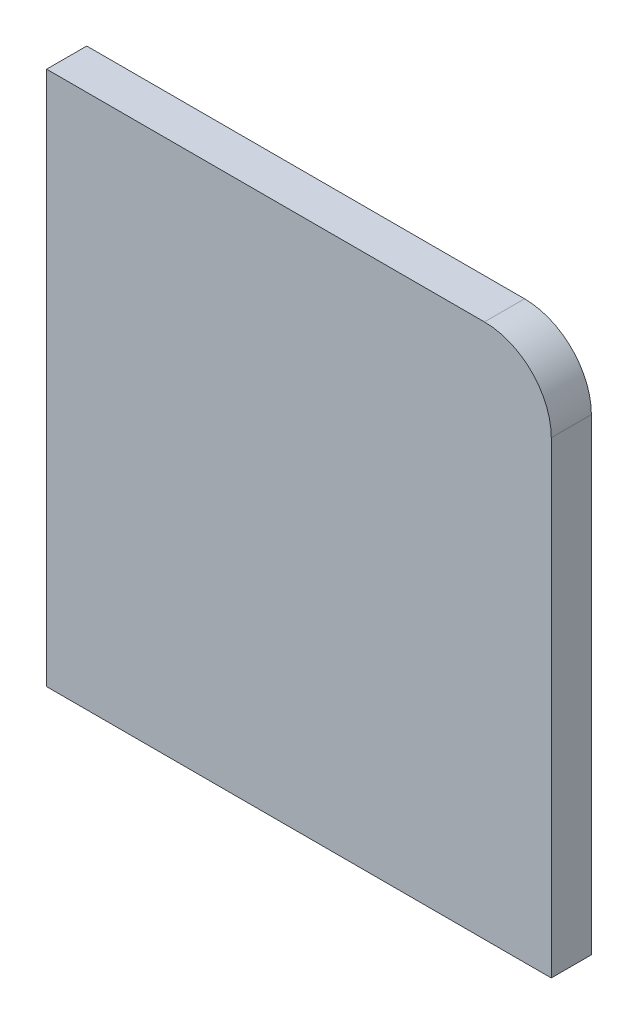
ISO-10303-21;
HEADER;
FILE_DESCRIPTION(('STEP AP214'),'2;1');
FILE_NAME('part.step','',(''),(''),'','','');
FILE_SCHEMA(('AUTOMOTIVE_DESIGN { 1 0 10303 214 1 1 1 1 }'));
ENDSEC;
DATA;
#1=APPLICATION_CONTEXT('core data for automotive mechanical design processes');
#2=APPLICATION_PROTOCOL_DEFINITION('international standard','automotive_design',2000,#1);
#3=PRODUCT_CONTEXT('',#1,'mechanical');
#4=PRODUCT('Part','Part','',(#3));
#5=PRODUCT_RELATED_PRODUCT_CATEGORY('part','',(#4));
#6=PRODUCT_DEFINITION_FORMATION('','',#4);
#7=PRODUCT_DEFINITION_CONTEXT('part definition',#1,'design');
#8=PRODUCT_DEFINITION('design','',#6,#7);
#9=PRODUCT_DEFINITION_SHAPE('','',#8);
#10=(LENGTH_UNIT() NAMED_UNIT(*) SI_UNIT(.MILLI.,.METRE.));
#11=(NAMED_UNIT(*) PLANE_ANGLE_UNIT() SI_UNIT($,.RADIAN.));
#12=(NAMED_UNIT(*) SI_UNIT($,.STERADIAN.) SOLID_ANGLE_UNIT());
#13=UNCERTAINTY_MEASURE_WITH_UNIT(LENGTH_MEASURE(1.E-05),#10,'distance_accuracy_value','');
#14=(GEOMETRIC_REPRESENTATION_CONTEXT(3) GLOBAL_UNCERTAINTY_ASSIGNED_CONTEXT((#13)) GLOBAL_UNIT_ASSIGNED_CONTEXT((#10,
#11,#12)) REPRESENTATION_CONTEXT('',''));
#15=CARTESIAN_POINT('',(0.,0.,0.));
#16=DIRECTION('',(0.,0.,1.));
#17=DIRECTION('',(1.,0.,0.));
#18=AXIS2_PLACEMENT_3D('',#15,#16,#17);
#19=CARTESIAN_POINT('',(-30.,50.,6.));
#20=DIRECTION('',(1.,0.,0.));
#21=DIRECTION('',(0.,0.,-1.));
#22=AXIS2_PLACEMENT_3D('',#19,#20,#21);
#23=PLANE('',#22);
#24=DIRECTION('',(0.,-1.,0.));
#25=VECTOR('',#24,1.);
#26=CARTESIAN_POINT('',(-30.,50.,0.));
#27=LINE('',#26,#25);
#28=CARTESIAN_POINT('',(-30.,50.,0.));
#29=VERTEX_POINT('',#28);
#30=CARTESIAN_POINT('',(-30.,-30.,0.));
#31=VERTEX_POINT('',#30);
#32=EDGE_CURVE('E79',#29,#31,#27,.T.);
#33=ORIENTED_EDGE('',*,*,#32,.T.);
#34=DIRECTION('',(0.,0.,-1.));
#35=VECTOR('',#34,1.);
#36=CARTESIAN_POINT('',(-30.,-30.,6.));
#37=LINE('',#36,#35);
#38=CARTESIAN_POINT('',(-30.,-30.,6.));
#39=VERTEX_POINT('',#38);
#40=EDGE_CURVE('E86',#39,#31,#37,.T.);
#41=ORIENTED_EDGE('',*,*,#40,.F.);
#42=DIRECTION('',(0.,-1.,0.));
#43=VECTOR('',#42,1.);
#44=CARTESIAN_POINT('',(-30.,50.,6.));
#45=LINE('',#44,#43);
#46=CARTESIAN_POINT('',(-30.,50.,6.));
#47=VERTEX_POINT('',#46);
#48=EDGE_CURVE('E103',#47,#39,#45,.T.);
#49=ORIENTED_EDGE('',*,*,#48,.F.);
#50=DIRECTION('',(0.,0.,-1.));
#51=VECTOR('',#50,1.);
#52=CARTESIAN_POINT('',(-30.,50.,6.));
#53=LINE('',#52,#51);
#54=EDGE_CURVE('E97',#47,#29,#53,.T.);
#55=ORIENTED_EDGE('',*,*,#54,.T.);
#56=EDGE_LOOP('',(#33,#41,#49,#55));
#57=FACE_BOUND('',#56,.T.);
#58=ADVANCED_FACE('F31',(#57),#23,.F.);
#59=CARTESIAN_POINT('',(-30.,-30.,6.));
#60=DIRECTION('',(0.,1.,0.));
#61=DIRECTION('',(0.,0.,1.));
#62=AXIS2_PLACEMENT_3D('',#59,#60,#61);
#63=PLANE('',#62);
#64=DIRECTION('',(1.,0.,0.));
#65=VECTOR('',#64,1.);
#66=CARTESIAN_POINT('',(-30.,-30.,0.));
#67=LINE('',#66,#65);
#68=CARTESIAN_POINT('',(45.5,-30.,0.));
#69=VERTEX_POINT('',#68);
#70=EDGE_CURVE('E75',#31,#69,#67,.T.);
#71=ORIENTED_EDGE('',*,*,#70,.T.);
#72=DIRECTION('',(0.,0.,-1.));
#73=VECTOR('',#72,1.);
#74=CARTESIAN_POINT('',(45.5,-30.,6.));
#75=LINE('',#74,#73);
#76=CARTESIAN_POINT('',(45.5,-30.,6.));
#77=VERTEX_POINT('',#76);
#78=EDGE_CURVE('E93',#77,#69,#75,.T.);
#79=ORIENTED_EDGE('',*,*,#78,.F.);
#80=DIRECTION('',(1.,0.,0.));
#81=VECTOR('',#80,1.);
#82=CARTESIAN_POINT('',(-30.,-30.,6.));
#83=LINE('',#82,#81);
#84=EDGE_CURVE('E88',#39,#77,#83,.T.);
#85=ORIENTED_EDGE('',*,*,#84,.F.);
#86=ORIENTED_EDGE('',*,*,#40,.T.);
#87=EDGE_LOOP('',(#71,#79,#85,#86));
#88=FACE_BOUND('',#87,.T.);
#89=ADVANCED_FACE('F87',(#88),#63,.F.);
#90=CARTESIAN_POINT('',(45.5,50.,6.));
#91=DIRECTION('',(-1.,0.,0.));
#92=DIRECTION('',(0.,-1.,0.));
#93=AXIS2_PLACEMENT_3D('',#90,#91,#92);
#94=PLANE('',#93);
#95=DIRECTION('',(0.,1.,0.));
#96=VECTOR('',#95,1.);
#97=CARTESIAN_POINT('',(45.5,50.,0.));
#98=LINE('',#97,#96);
#99=CARTESIAN_POINT('',(45.5,40.,0.));
#100=VERTEX_POINT('',#99);
#101=EDGE_CURVE('E80',#69,#100,#98,.T.);
#102=ORIENTED_EDGE('',*,*,#101,.T.);
#103=DIRECTION('',(0.,0.,-1.));
#104=VECTOR('',#103,1.);
#105=CARTESIAN_POINT('',(45.5,40.,6.));
#106=LINE('',#105,#104);
#107=CARTESIAN_POINT('',(45.5,40.,6.));
#108=VERTEX_POINT('',#107);
#109=EDGE_CURVE('E38',#100,#108,#106,.F.);
#110=ORIENTED_EDGE('',*,*,#109,.T.);
#111=DIRECTION('',(0.,1.,0.));
#112=VECTOR('',#111,1.);
#113=CARTESIAN_POINT('',(45.5,50.,6.));
#114=LINE('',#113,#112);
#115=EDGE_CURVE('E106',#77,#108,#114,.T.);
#116=ORIENTED_EDGE('',*,*,#115,.F.);
#117=ORIENTED_EDGE('',*,*,#78,.T.);
#118=EDGE_LOOP('',(#102,#110,#116,#117));
#119=FACE_BOUND('',#118,.T.);
#120=ADVANCED_FACE('F123',(#119),#94,.F.);
#121=CARTESIAN_POINT('',(-30.,50.,6.));
#122=DIRECTION('',(0.,-1.,0.));
#123=DIRECTION('',(0.,0.,-1.));
#124=AXIS2_PLACEMENT_3D('',#121,#122,#123);
#125=PLANE('',#124);
#126=DIRECTION('',(-1.,0.,0.));
#127=VECTOR('',#126,1.);
#128=CARTESIAN_POINT('',(-30.,50.,6.));
#129=LINE('',#128,#127);
#130=CARTESIAN_POINT('',(35.5,50.,6.));
#131=VERTEX_POINT('',#130);
#132=EDGE_CURVE('E108',#131,#47,#129,.T.);
#133=ORIENTED_EDGE('',*,*,#132,.F.);
#134=DIRECTION('',(0.,0.,-1.));
#135=VECTOR('',#134,1.);
#136=CARTESIAN_POINT('',(35.5,50.,6.));
#137=LINE('',#136,#135);
#138=CARTESIAN_POINT('',(35.5,50.,0.));
#139=VERTEX_POINT('',#138);
#140=EDGE_CURVE('E92',#131,#139,#137,.T.);
#141=ORIENTED_EDGE('',*,*,#140,.T.);
#142=DIRECTION('',(-1.,0.,0.));
#143=VECTOR('',#142,1.);
#144=CARTESIAN_POINT('',(-30.,50.,0.));
#145=LINE('',#144,#143);
#146=EDGE_CURVE('E101',#139,#29,#145,.T.);
#147=ORIENTED_EDGE('',*,*,#146,.T.);
#148=ORIENTED_EDGE('',*,*,#54,.F.);
#149=EDGE_LOOP('',(#133,#141,#147,#148));
#150=FACE_BOUND('',#149,.T.);
#151=ADVANCED_FACE('F117',(#150),#125,.F.);
#152=CARTESIAN_POINT('',(-30.,-30.,6.));
#153=DIRECTION('',(0.,0.,1.));
#154=DIRECTION('',(1.,0.,0.));
#155=AXIS2_PLACEMENT_3D('',#152,#153,#154);
#156=PLANE('',#155);
#157=ORIENTED_EDGE('',*,*,#115,.T.);
#158=CARTESIAN_POINT('',(35.5,40.,6.));
#159=DIRECTION('',(0.,0.,1.));
#160=DIRECTION('',(1.,0.,0.));
#161=AXIS2_PLACEMENT_3D('',#158,#159,#160);
#162=CIRCLE('',#161,10.);
#163=EDGE_CURVE('E11',#108,#131,#162,.T.);
#164=ORIENTED_EDGE('',*,*,#163,.T.);
#165=ORIENTED_EDGE('',*,*,#132,.T.);
#166=ORIENTED_EDGE('',*,*,#48,.T.);
#167=ORIENTED_EDGE('',*,*,#84,.T.);
#168=EDGE_LOOP('',(#157,#164,#165,#166,#167));
#169=FACE_BOUND('',#168,.T.);
#170=ADVANCED_FACE('F122',(#169),#156,.T.);
#171=CARTESIAN_POINT('',(-30.,-30.,0.));
#172=DIRECTION('',(0.,0.,1.));
#173=DIRECTION('',(1.,0.,0.));
#174=AXIS2_PLACEMENT_3D('',#171,#172,#173);
#175=PLANE('',#174);
#176=ORIENTED_EDGE('',*,*,#146,.F.);
#177=CARTESIAN_POINT('',(35.5,40.,0.));
#178=DIRECTION('',(0.,0.,1.));
#179=DIRECTION('',(1.,0.,0.));
#180=AXIS2_PLACEMENT_3D('',#177,#178,#179);
#181=CIRCLE('',#180,10.);
#182=EDGE_CURVE('E52',#139,#100,#181,.F.);
#183=ORIENTED_EDGE('',*,*,#182,.T.);
#184=ORIENTED_EDGE('',*,*,#101,.F.);
#185=ORIENTED_EDGE('',*,*,#70,.F.);
#186=ORIENTED_EDGE('',*,*,#32,.F.);
#187=EDGE_LOOP('',(#176,#183,#184,#185,#186));
#188=FACE_BOUND('',#187,.T.);
#189=ADVANCED_FACE('F77',(#188),#175,.F.);
#190=CARTESIAN_POINT('',(35.5,40.,6.));
#191=DIRECTION('',(0.,0.,-1.));
#192=DIRECTION('',(-1.,0.,0.));
#193=AXIS2_PLACEMENT_3D('',#190,#191,#192);
#194=CYLINDRICAL_SURFACE('',#193,10.);
#195=ORIENTED_EDGE('',*,*,#163,.F.);
#196=ORIENTED_EDGE('',*,*,#109,.F.);
#197=ORIENTED_EDGE('',*,*,#182,.F.);
#198=ORIENTED_EDGE('',*,*,#140,.F.);
#199=EDGE_LOOP('',(#195,#196,#197,#198));
#200=FACE_BOUND('',#199,.T.);
#201=ADVANCED_FACE('F120',(#200),#194,.T.);
#202=CLOSED_SHELL('',(#58,#89,#120,#151,#170,#189,#201));
#203=MANIFOLD_SOLID_BREP('B2',#202);
#204=ADVANCED_BREP_SHAPE_REPRESENTATION('',(#18,#203),#14);
#205=SHAPE_DEFINITION_REPRESENTATION(#9,#204);
ENDSEC;
END-ISO-10303-21;
